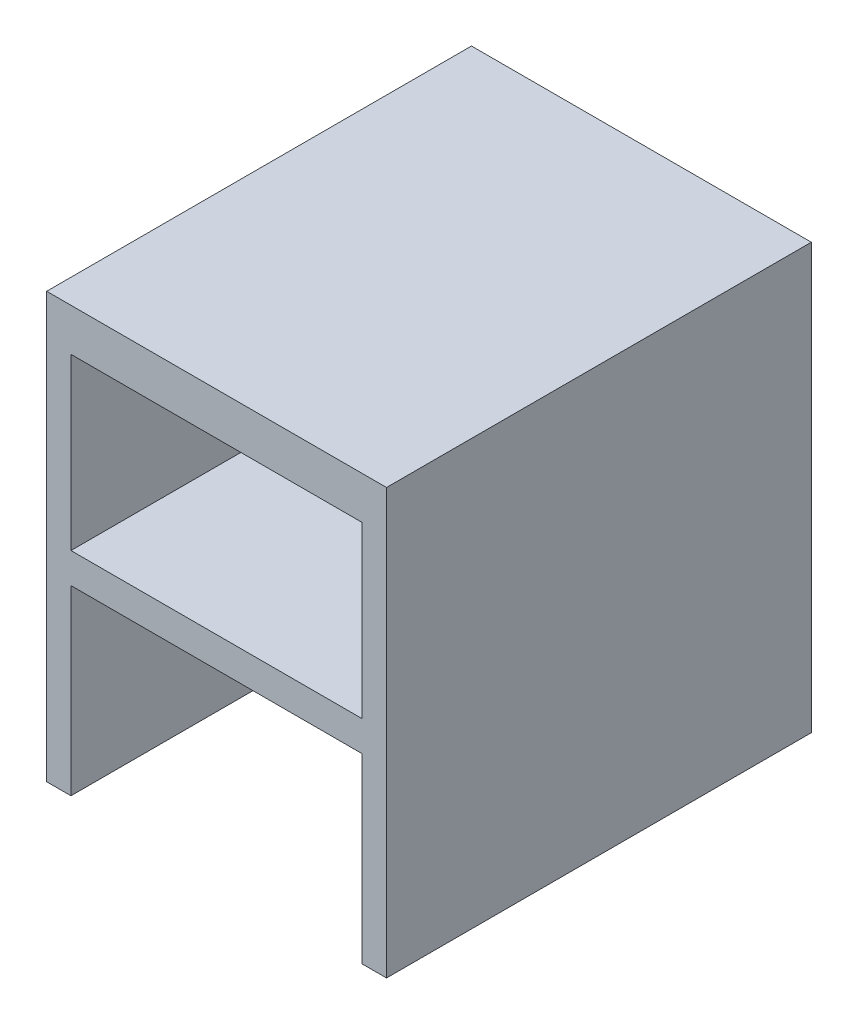
ISO-10303-21;
HEADER;
FILE_DESCRIPTION(('STEP AP214'),'2;1');
FILE_NAME('part.step','',(''),(''),'','','');
FILE_SCHEMA(('AUTOMOTIVE_DESIGN { 1 0 10303 214 1 1 1 1 }'));
ENDSEC;
DATA;
#1=APPLICATION_CONTEXT('core data for automotive mechanical design processes');
#2=APPLICATION_PROTOCOL_DEFINITION('international standard','automotive_design',2000,#1);
#3=PRODUCT_CONTEXT('',#1,'mechanical');
#4=PRODUCT('Part','Part','',(#3));
#5=PRODUCT_RELATED_PRODUCT_CATEGORY('part','',(#4));
#6=PRODUCT_DEFINITION_FORMATION('','',#4);
#7=PRODUCT_DEFINITION_CONTEXT('part definition',#1,'design');
#8=PRODUCT_DEFINITION('design','',#6,#7);
#9=PRODUCT_DEFINITION_SHAPE('','',#8);
#10=(LENGTH_UNIT() NAMED_UNIT(*) SI_UNIT(.MILLI.,.METRE.));
#11=(NAMED_UNIT(*) PLANE_ANGLE_UNIT() SI_UNIT($,.RADIAN.));
#12=(NAMED_UNIT(*) SI_UNIT($,.STERADIAN.) SOLID_ANGLE_UNIT());
#13=UNCERTAINTY_MEASURE_WITH_UNIT(LENGTH_MEASURE(1.E-05),#10,'distance_accuracy_value','');
#14=(GEOMETRIC_REPRESENTATION_CONTEXT(3) GLOBAL_UNCERTAINTY_ASSIGNED_CONTEXT((#13)) GLOBAL_UNIT_ASSIGNED_CONTEXT((#10,
#11,#12)) REPRESENTATION_CONTEXT('',''));
#15=CARTESIAN_POINT('',(0.,0.,0.));
#16=DIRECTION('',(0.,0.,1.));
#17=DIRECTION('',(1.,0.,0.));
#18=AXIS2_PLACEMENT_3D('',#15,#16,#17);
#19=CARTESIAN_POINT('',(4.00000000000001,0.,70.));
#20=DIRECTION('',(1.,0.,0.));
#21=DIRECTION('',(0.,1.,0.));
#22=AXIS2_PLACEMENT_3D('',#19,#20,#21);
#23=PLANE('',#22);
#24=DIRECTION('',(0.,-1.,0.));
#25=VECTOR('',#24,1.);
#26=CARTESIAN_POINT('',(4.00000000000001,0.,0.));
#27=LINE('',#26,#25);
#28=CARTESIAN_POINT('',(4.,30.,0.));
#29=VERTEX_POINT('',#28);
#30=CARTESIAN_POINT('',(4.00000000000001,0.,0.));
#31=VERTEX_POINT('',#30);
#32=EDGE_CURVE('E209',#29,#31,#27,.T.);
#33=ORIENTED_EDGE('',*,*,#32,.F.);
#34=DIRECTION('',(0.,0.,1.));
#35=VECTOR('',#34,1.);
#36=CARTESIAN_POINT('',(4.,30.,70.));
#37=LINE('',#36,#35);
#38=CARTESIAN_POINT('',(4.,30.,70.));
#39=VERTEX_POINT('',#38);
#40=EDGE_CURVE('E12',#29,#39,#37,.T.);
#41=ORIENTED_EDGE('',*,*,#40,.T.);
#42=DIRECTION('',(0.,-1.,0.));
#43=VECTOR('',#42,1.);
#44=CARTESIAN_POINT('',(4.00000000000001,0.,70.));
#45=LINE('',#44,#43);
#46=CARTESIAN_POINT('',(4.00000000000001,0.,70.));
#47=VERTEX_POINT('',#46);
#48=EDGE_CURVE('E160',#39,#47,#45,.T.);
#49=ORIENTED_EDGE('',*,*,#48,.T.);
#50=DIRECTION('',(0.,0.,-1.));
#51=VECTOR('',#50,1.);
#52=CARTESIAN_POINT('',(4.00000000000001,0.,70.));
#53=LINE('',#52,#51);
#54=EDGE_CURVE('E163',#47,#31,#53,.T.);
#55=ORIENTED_EDGE('',*,*,#54,.T.);
#56=EDGE_LOOP('',(#33,#41,#49,#55));
#57=FACE_BOUND('',#56,.T.);
#58=ADVANCED_FACE('F69',(#57),#23,.T.);
#59=DIRECTION('',(0.,0.,1.));
#60=VECTOR('',#59,1.);
#61=CARTESIAN_POINT('',(4.,35.,70.));
#62=LINE('',#61,#60);
#63=CARTESIAN_POINT('',(4.,35.,0.));
#64=VERTEX_POINT('',#63);
#65=CARTESIAN_POINT('',(4.,35.,70.));
#66=VERTEX_POINT('',#65);
#67=EDGE_CURVE('E78',#64,#66,#62,.T.);
#68=ORIENTED_EDGE('',*,*,#67,.F.);
#69=CARTESIAN_POINT('',(3.99999999999999,63.,0.));
#70=VERTEX_POINT('',#69);
#71=EDGE_CURVE('E211',#70,#64,#27,.T.);
#72=ORIENTED_EDGE('',*,*,#71,.F.);
#73=DIRECTION('',(0.,0.,-1.));
#74=VECTOR('',#73,1.);
#75=CARTESIAN_POINT('',(3.99999999999999,63.,70.));
#76=LINE('',#75,#74);
#77=CARTESIAN_POINT('',(3.99999999999999,63.,70.));
#78=VERTEX_POINT('',#77);
#79=EDGE_CURVE('E176',#78,#70,#76,.T.);
#80=ORIENTED_EDGE('',*,*,#79,.F.);
#81=EDGE_CURVE('E167',#78,#66,#45,.T.);
#82=ORIENTED_EDGE('',*,*,#81,.T.);
#83=EDGE_LOOP('',(#68,#72,#80,#82));
#84=FACE_BOUND('',#83,.T.);
#85=ADVANCED_FACE('F264',(#84),#23,.T.);
#86=CARTESIAN_POINT('',(0.,63.,70.));
#87=DIRECTION('',(0.,-1.,0.));
#88=DIRECTION('',(0.,0.,-1.));
#89=AXIS2_PLACEMENT_3D('',#86,#87,#88);
#90=PLANE('',#89);
#91=DIRECTION('',(-1.,0.,0.));
#92=VECTOR('',#91,1.);
#93=CARTESIAN_POINT('',(0.,63.,0.));
#94=LINE('',#93,#92);
#95=CARTESIAN_POINT('',(52.,63.,0.));
#96=VERTEX_POINT('',#95);
#97=EDGE_CURVE('E214',#96,#70,#94,.T.);
#98=ORIENTED_EDGE('',*,*,#97,.F.);
#99=DIRECTION('',(0.,0.,-1.));
#100=VECTOR('',#99,1.);
#101=CARTESIAN_POINT('',(52.,63.,70.));
#102=LINE('',#101,#100);
#103=CARTESIAN_POINT('',(52.,63.,70.));
#104=VERTEX_POINT('',#103);
#105=EDGE_CURVE('E238',#104,#96,#102,.T.);
#106=ORIENTED_EDGE('',*,*,#105,.F.);
#107=DIRECTION('',(-1.,0.,0.));
#108=VECTOR('',#107,1.);
#109=CARTESIAN_POINT('',(0.,63.,70.));
#110=LINE('',#109,#108);
#111=EDGE_CURVE('E190',#104,#78,#110,.T.);
#112=ORIENTED_EDGE('',*,*,#111,.T.);
#113=ORIENTED_EDGE('',*,*,#79,.T.);
#114=EDGE_LOOP('',(#98,#106,#112,#113));
#115=FACE_BOUND('',#114,.T.);
#116=ADVANCED_FACE('F261',(#115),#90,.T.);
#117=CARTESIAN_POINT('',(52.,0.,70.));
#118=DIRECTION('',(-1.,0.,0.));
#119=DIRECTION('',(0.,-1.,0.));
#120=AXIS2_PLACEMENT_3D('',#117,#118,#119);
#121=PLANE('',#120);
#122=DIRECTION('',(0.,0.,-1.));
#123=VECTOR('',#122,1.);
#124=CARTESIAN_POINT('',(52.,35.,70.));
#125=LINE('',#124,#123);
#126=CARTESIAN_POINT('',(52.,35.,70.));
#127=VERTEX_POINT('',#126);
#128=CARTESIAN_POINT('',(52.,35.,0.));
#129=VERTEX_POINT('',#128);
#130=EDGE_CURVE('E86',#127,#129,#125,.T.);
#131=ORIENTED_EDGE('',*,*,#130,.F.);
#132=DIRECTION('',(0.,1.,0.));
#133=VECTOR('',#132,1.);
#134=CARTESIAN_POINT('',(52.,0.,70.));
#135=LINE('',#134,#133);
#136=EDGE_CURVE('E193',#127,#104,#135,.T.);
#137=ORIENTED_EDGE('',*,*,#136,.T.);
#138=ORIENTED_EDGE('',*,*,#105,.T.);
#139=DIRECTION('',(0.,1.,0.));
#140=VECTOR('',#139,1.);
#141=CARTESIAN_POINT('',(52.,0.,0.));
#142=LINE('',#141,#140);
#143=EDGE_CURVE('E217',#129,#96,#142,.T.);
#144=ORIENTED_EDGE('',*,*,#143,.F.);
#145=EDGE_LOOP('',(#131,#137,#138,#144));
#146=FACE_BOUND('',#145,.T.);
#147=ADVANCED_FACE('F255',(#146),#121,.T.);
#148=CARTESIAN_POINT('',(52.,0.,70.));
#149=VERTEX_POINT('',#148);
#150=CARTESIAN_POINT('',(52.,30.,70.));
#151=VERTEX_POINT('',#150);
#152=EDGE_CURVE('E194',#149,#151,#135,.T.);
#153=ORIENTED_EDGE('',*,*,#152,.T.);
#154=DIRECTION('',(0.,0.,-1.));
#155=VECTOR('',#154,1.);
#156=CARTESIAN_POINT('',(52.,30.,70.));
#157=LINE('',#156,#155);
#158=CARTESIAN_POINT('',(52.,30.,0.));
#159=VERTEX_POINT('',#158);
#160=EDGE_CURVE('E94',#151,#159,#157,.T.);
#161=ORIENTED_EDGE('',*,*,#160,.T.);
#162=CARTESIAN_POINT('',(52.,0.,0.));
#163=VERTEX_POINT('',#162);
#164=EDGE_CURVE('E218',#163,#159,#142,.T.);
#165=ORIENTED_EDGE('',*,*,#164,.F.);
#166=DIRECTION('',(0.,0.,-1.));
#167=VECTOR('',#166,1.);
#168=CARTESIAN_POINT('',(52.,0.,70.));
#169=LINE('',#168,#167);
#170=EDGE_CURVE('E236',#149,#163,#169,.T.);
#171=ORIENTED_EDGE('',*,*,#170,.F.);
#172=EDGE_LOOP('',(#153,#161,#165,#171));
#173=FACE_BOUND('',#172,.T.);
#174=ADVANCED_FACE('F347',(#173),#121,.T.);
#175=CARTESIAN_POINT('',(0.,0.,70.));
#176=DIRECTION('',(0.,-1.,0.));
#177=DIRECTION('',(1.,0.,0.));
#178=AXIS2_PLACEMENT_3D('',#175,#176,#177);
#179=PLANE('',#178);
#180=DIRECTION('',(-1.,0.,0.));
#181=VECTOR('',#180,1.);
#182=CARTESIAN_POINT('',(0.,0.,0.));
#183=LINE('',#182,#181);
#184=CARTESIAN_POINT('',(56.,0.,0.));
#185=VERTEX_POINT('',#184);
#186=EDGE_CURVE('E221',#185,#163,#183,.T.);
#187=ORIENTED_EDGE('',*,*,#186,.F.);
#188=DIRECTION('',(0.,0.,-1.));
#189=VECTOR('',#188,1.);
#190=CARTESIAN_POINT('',(56.,0.,70.));
#191=LINE('',#190,#189);
#192=CARTESIAN_POINT('',(56.,0.,70.));
#193=VERTEX_POINT('',#192);
#194=EDGE_CURVE('E234',#193,#185,#191,.T.);
#195=ORIENTED_EDGE('',*,*,#194,.F.);
#196=DIRECTION('',(-1.,0.,0.));
#197=VECTOR('',#196,1.);
#198=CARTESIAN_POINT('',(0.,0.,70.));
#199=LINE('',#198,#197);
#200=EDGE_CURVE('E197',#193,#149,#199,.T.);
#201=ORIENTED_EDGE('',*,*,#200,.T.);
#202=ORIENTED_EDGE('',*,*,#170,.T.);
#203=EDGE_LOOP('',(#187,#195,#201,#202));
#204=FACE_BOUND('',#203,.T.);
#205=ADVANCED_FACE('F337',(#204),#179,.T.);
#206=CARTESIAN_POINT('',(56.,0.,70.));
#207=DIRECTION('',(1.,0.,0.));
#208=DIRECTION('',(0.,1.,0.));
#209=AXIS2_PLACEMENT_3D('',#206,#207,#208);
#210=PLANE('',#209);
#211=DIRECTION('',(0.,-1.,0.));
#212=VECTOR('',#211,1.);
#213=CARTESIAN_POINT('',(56.,0.,0.));
#214=LINE('',#213,#212);
#215=CARTESIAN_POINT('',(56.,70.,0.));
#216=VERTEX_POINT('',#215);
#217=EDGE_CURVE('E224',#216,#185,#214,.T.);
#218=ORIENTED_EDGE('',*,*,#217,.F.);
#219=DIRECTION('',(0.,0.,-1.));
#220=VECTOR('',#219,1.);
#221=CARTESIAN_POINT('',(56.,70.,70.));
#222=LINE('',#221,#220);
#223=CARTESIAN_POINT('',(56.,70.,70.));
#224=VERTEX_POINT('',#223);
#225=EDGE_CURVE('E232',#224,#216,#222,.T.);
#226=ORIENTED_EDGE('',*,*,#225,.F.);
#227=DIRECTION('',(0.,-1.,0.));
#228=VECTOR('',#227,1.);
#229=CARTESIAN_POINT('',(56.,0.,70.));
#230=LINE('',#229,#228);
#231=EDGE_CURVE('E200',#224,#193,#230,.T.);
#232=ORIENTED_EDGE('',*,*,#231,.T.);
#233=ORIENTED_EDGE('',*,*,#194,.T.);
#234=EDGE_LOOP('',(#218,#226,#232,#233));
#235=FACE_BOUND('',#234,.T.);
#236=ADVANCED_FACE('F327',(#235),#210,.T.);
#237=CARTESIAN_POINT('',(0.,70.,70.));
#238=DIRECTION('',(0.,1.,0.));
#239=DIRECTION('',(0.,0.,1.));
#240=AXIS2_PLACEMENT_3D('',#237,#238,#239);
#241=PLANE('',#240);
#242=DIRECTION('',(1.,0.,0.));
#243=VECTOR('',#242,1.);
#244=CARTESIAN_POINT('',(0.,70.,0.));
#245=LINE('',#244,#243);
#246=CARTESIAN_POINT('',(0.,70.,0.));
#247=VERTEX_POINT('',#246);
#248=EDGE_CURVE('E186',#247,#216,#245,.T.);
#249=ORIENTED_EDGE('',*,*,#248,.F.);
#250=DIRECTION('',(0.,0.,-1.));
#251=VECTOR('',#250,1.);
#252=CARTESIAN_POINT('',(0.,70.,70.));
#253=LINE('',#252,#251);
#254=CARTESIAN_POINT('',(0.,70.,70.));
#255=VERTEX_POINT('',#254);
#256=EDGE_CURVE('E230',#255,#247,#253,.T.);
#257=ORIENTED_EDGE('',*,*,#256,.F.);
#258=DIRECTION('',(1.,0.,0.));
#259=VECTOR('',#258,1.);
#260=CARTESIAN_POINT('',(0.,70.,70.));
#261=LINE('',#260,#259);
#262=EDGE_CURVE('E203',#255,#224,#261,.T.);
#263=ORIENTED_EDGE('',*,*,#262,.T.);
#264=ORIENTED_EDGE('',*,*,#225,.T.);
#265=EDGE_LOOP('',(#249,#257,#263,#264));
#266=FACE_BOUND('',#265,.T.);
#267=ADVANCED_FACE('F317',(#266),#241,.T.);
#268=CARTESIAN_POINT('',(0.,0.,70.));
#269=DIRECTION('',(-1.,0.,0.));
#270=DIRECTION('',(0.,0.,1.));
#271=AXIS2_PLACEMENT_3D('',#268,#269,#270);
#272=PLANE('',#271);
#273=DIRECTION('',(0.,1.,0.));
#274=VECTOR('',#273,1.);
#275=CARTESIAN_POINT('',(0.,0.,0.));
#276=LINE('',#275,#274);
#277=CARTESIAN_POINT('',(0.,0.,0.));
#278=VERTEX_POINT('',#277);
#279=EDGE_CURVE('E183',#278,#247,#276,.T.);
#280=ORIENTED_EDGE('',*,*,#279,.F.);
#281=DIRECTION('',(0.,0.,-1.));
#282=VECTOR('',#281,1.);
#283=CARTESIAN_POINT('',(0.,0.,70.));
#284=LINE('',#283,#282);
#285=CARTESIAN_POINT('',(0.,0.,70.));
#286=VERTEX_POINT('',#285);
#287=EDGE_CURVE('E207',#286,#278,#284,.T.);
#288=ORIENTED_EDGE('',*,*,#287,.F.);
#289=DIRECTION('',(0.,1.,0.));
#290=VECTOR('',#289,1.);
#291=CARTESIAN_POINT('',(0.,0.,70.));
#292=LINE('',#291,#290);
#293=EDGE_CURVE('E182',#286,#255,#292,.T.);
#294=ORIENTED_EDGE('',*,*,#293,.T.);
#295=ORIENTED_EDGE('',*,*,#256,.T.);
#296=EDGE_LOOP('',(#280,#288,#294,#295));
#297=FACE_BOUND('',#296,.T.);
#298=ADVANCED_FACE('F284',(#297),#272,.T.);
#299=CARTESIAN_POINT('',(0.,0.,70.));
#300=DIRECTION('',(0.,-1.,0.));
#301=DIRECTION('',(1.,0.,0.));
#302=AXIS2_PLACEMENT_3D('',#299,#300,#301);
#303=PLANE('',#302);
#304=DIRECTION('',(-1.,0.,0.));
#305=VECTOR('',#304,1.);
#306=CARTESIAN_POINT('',(0.,0.,0.));
#307=LINE('',#306,#305);
#308=EDGE_CURVE('E175',#31,#278,#307,.T.);
#309=ORIENTED_EDGE('',*,*,#308,.F.);
#310=ORIENTED_EDGE('',*,*,#54,.F.);
#311=DIRECTION('',(-1.,0.,0.));
#312=VECTOR('',#311,1.);
#313=CARTESIAN_POINT('',(0.,0.,70.));
#314=LINE('',#313,#312);
#315=EDGE_CURVE('E168',#47,#286,#314,.T.);
#316=ORIENTED_EDGE('',*,*,#315,.T.);
#317=ORIENTED_EDGE('',*,*,#287,.T.);
#318=EDGE_LOOP('',(#309,#310,#316,#317));
#319=FACE_BOUND('',#318,.T.);
#320=ADVANCED_FACE('F172',(#319),#303,.T.);
#321=CARTESIAN_POINT('',(0.,0.,0.));
#322=DIRECTION('',(0.,0.,1.));
#323=DIRECTION('',(1.,0.,0.));
#324=AXIS2_PLACEMENT_3D('',#321,#322,#323);
#325=PLANE('',#324);
#326=DIRECTION('',(1.,0.,0.));
#327=VECTOR('',#326,1.);
#328=CARTESIAN_POINT('',(4.,30.,0.));
#329=LINE('',#328,#327);
#330=EDGE_CURVE('E247',#29,#159,#329,.T.);
#331=ORIENTED_EDGE('',*,*,#330,.F.);
#332=ORIENTED_EDGE('',*,*,#32,.T.);
#333=ORIENTED_EDGE('',*,*,#308,.T.);
#334=ORIENTED_EDGE('',*,*,#279,.T.);
#335=ORIENTED_EDGE('',*,*,#248,.T.);
#336=ORIENTED_EDGE('',*,*,#217,.T.);
#337=ORIENTED_EDGE('',*,*,#186,.T.);
#338=ORIENTED_EDGE('',*,*,#164,.T.);
#339=EDGE_LOOP('',(#331,#332,#333,#334,#335,#336,#337,#338));
#340=FACE_BOUND('',#339,.T.);
#341=ORIENTED_EDGE('',*,*,#71,.T.);
#342=DIRECTION('',(1.,0.,0.));
#343=VECTOR('',#342,1.);
#344=CARTESIAN_POINT('',(4.,35.,0.));
#345=LINE('',#344,#343);
#346=EDGE_CURVE('E73',#64,#129,#345,.T.);
#347=ORIENTED_EDGE('',*,*,#346,.T.);
#348=ORIENTED_EDGE('',*,*,#143,.T.);
#349=ORIENTED_EDGE('',*,*,#97,.T.);
#350=EDGE_LOOP('',(#341,#347,#348,#349));
#351=FACE_BOUND('',#350,.T.);
#352=ADVANCED_FACE('F252',(#340,#351),#325,.F.);
#353=CARTESIAN_POINT('',(0.,0.,70.));
#354=DIRECTION('',(0.,0.,1.));
#355=DIRECTION('',(1.,0.,0.));
#356=AXIS2_PLACEMENT_3D('',#353,#354,#355);
#357=PLANE('',#356);
#358=ORIENTED_EDGE('',*,*,#48,.F.);
#359=DIRECTION('',(1.,0.,0.));
#360=VECTOR('',#359,1.);
#361=CARTESIAN_POINT('',(4.,30.,70.));
#362=LINE('',#361,#360);
#363=EDGE_CURVE('E245',#39,#151,#362,.T.);
#364=ORIENTED_EDGE('',*,*,#363,.T.);
#365=ORIENTED_EDGE('',*,*,#152,.F.);
#366=ORIENTED_EDGE('',*,*,#200,.F.);
#367=ORIENTED_EDGE('',*,*,#231,.F.);
#368=ORIENTED_EDGE('',*,*,#262,.F.);
#369=ORIENTED_EDGE('',*,*,#293,.F.);
#370=ORIENTED_EDGE('',*,*,#315,.F.);
#371=EDGE_LOOP('',(#358,#364,#365,#366,#367,#368,#369,#370));
#372=FACE_BOUND('',#371,.T.);
#373=DIRECTION('',(1.,0.,0.));
#374=VECTOR('',#373,1.);
#375=CARTESIAN_POINT('',(4.,35.,70.));
#376=LINE('',#375,#374);
#377=EDGE_CURVE('E210',#66,#127,#376,.T.);
#378=ORIENTED_EDGE('',*,*,#377,.F.);
#379=ORIENTED_EDGE('',*,*,#81,.F.);
#380=ORIENTED_EDGE('',*,*,#111,.F.);
#381=ORIENTED_EDGE('',*,*,#136,.F.);
#382=EDGE_LOOP('',(#378,#379,#380,#381));
#383=FACE_BOUND('',#382,.T.);
#384=ADVANCED_FACE('F178',(#372,#383),#357,.T.);
#385=CARTESIAN_POINT('',(4.,30.,70.));
#386=DIRECTION('',(0.,1.,0.));
#387=DIRECTION('',(0.,0.,1.));
#388=AXIS2_PLACEMENT_3D('',#385,#386,#387);
#389=PLANE('',#388);
#390=ORIENTED_EDGE('',*,*,#330,.T.);
#391=ORIENTED_EDGE('',*,*,#160,.F.);
#392=ORIENTED_EDGE('',*,*,#363,.F.);
#393=ORIENTED_EDGE('',*,*,#40,.F.);
#394=EDGE_LOOP('',(#390,#391,#392,#393));
#395=FACE_BOUND('',#394,.T.);
#396=ADVANCED_FACE('F71',(#395),#389,.F.);
#397=CARTESIAN_POINT('',(4.,35.,70.));
#398=DIRECTION('',(0.,1.,0.));
#399=DIRECTION('',(0.,0.,1.));
#400=AXIS2_PLACEMENT_3D('',#397,#398,#399);
#401=PLANE('',#400);
#402=ORIENTED_EDGE('',*,*,#346,.F.);
#403=ORIENTED_EDGE('',*,*,#67,.T.);
#404=ORIENTED_EDGE('',*,*,#377,.T.);
#405=ORIENTED_EDGE('',*,*,#130,.T.);
#406=EDGE_LOOP('',(#402,#403,#404,#405));
#407=FACE_BOUND('',#406,.T.);
#408=ADVANCED_FACE('F266',(#407),#401,.T.);
#409=CLOSED_SHELL('',(#58,#85,#116,#147,#174,#205,#236,#267,#298,#320,#352,#384,#396,#408));
#410=MANIFOLD_SOLID_BREP('B2',#409);
#411=ADVANCED_BREP_SHAPE_REPRESENTATION('',(#18,#410),#14);
#412=SHAPE_DEFINITION_REPRESENTATION(#9,#411);
ENDSEC;
END-ISO-10303-21;
